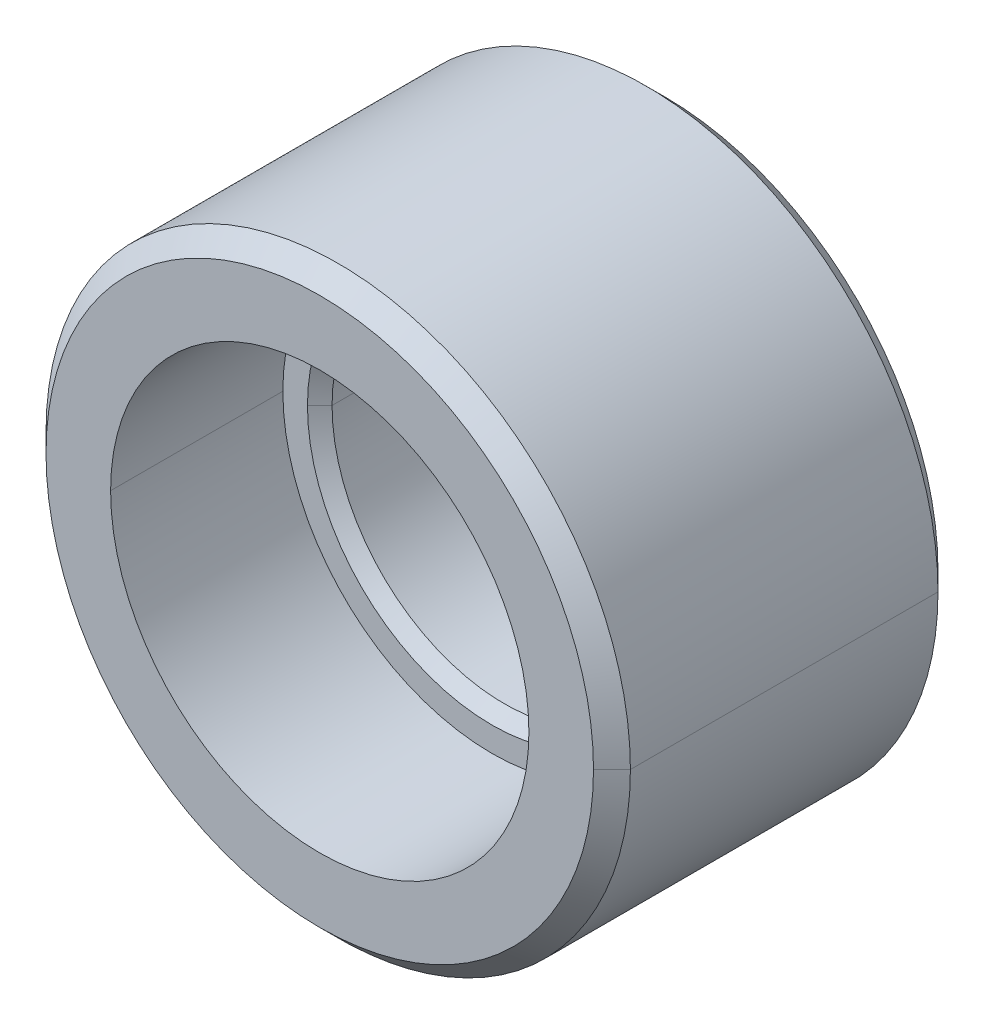
ISO-10303-21;
HEADER;
FILE_DESCRIPTION(('STEP AP214'),'2;1');
FILE_NAME('part.step','',(''),(''),'','','');
FILE_SCHEMA(('AUTOMOTIVE_DESIGN { 1 0 10303 214 1 1 1 1 }'));
ENDSEC;
DATA;
#1=APPLICATION_CONTEXT('core data for automotive mechanical design processes');
#2=APPLICATION_PROTOCOL_DEFINITION('international standard','automotive_design',2000,#1);
#3=PRODUCT_CONTEXT('',#1,'mechanical');
#4=PRODUCT('Part','Part','',(#3));
#5=PRODUCT_RELATED_PRODUCT_CATEGORY('part','',(#4));
#6=PRODUCT_DEFINITION_FORMATION('','',#4);
#7=PRODUCT_DEFINITION_CONTEXT('part definition',#1,'design');
#8=PRODUCT_DEFINITION('design','',#6,#7);
#9=PRODUCT_DEFINITION_SHAPE('','',#8);
#10=(LENGTH_UNIT() NAMED_UNIT(*) SI_UNIT(.MILLI.,.METRE.));
#11=(NAMED_UNIT(*) PLANE_ANGLE_UNIT() SI_UNIT($,.RADIAN.));
#12=(NAMED_UNIT(*) SI_UNIT($,.STERADIAN.) SOLID_ANGLE_UNIT());
#13=UNCERTAINTY_MEASURE_WITH_UNIT(LENGTH_MEASURE(1.E-05),#10,'distance_accuracy_value','');
#14=(GEOMETRIC_REPRESENTATION_CONTEXT(3) GLOBAL_UNCERTAINTY_ASSIGNED_CONTEXT((#13)) GLOBAL_UNIT_ASSIGNED_CONTEXT((#10,
#11,#12)) REPRESENTATION_CONTEXT('',''));
#15=CARTESIAN_POINT('',(0.,0.,0.));
#16=DIRECTION('',(0.,0.,1.));
#17=DIRECTION('',(1.,0.,0.));
#18=AXIS2_PLACEMENT_3D('',#15,#16,#17);
#19=CARTESIAN_POINT('',(0.,0.,1.39999999993279));
#20=DIRECTION('',(0.,0.,1.));
#21=DIRECTION('',(1.,0.,0.));
#22=AXIS2_PLACEMENT_3D('',#19,#20,#21);
#23=CONICAL_SURFACE('',#22,1.49999999990769,0.785398163397448);
#24=DIRECTION('',(-0.707106781186548,0.,0.707106781186548));
#25=VECTOR('',#24,1.);
#26=CARTESIAN_POINT('',(-1.49999999990769,0.,1.39999999993279));
#27=LINE('',#26,#25);
#28=CARTESIAN_POINT('',(-1.4,0.,1.30000000001));
#29=VERTEX_POINT('',#28);
#30=CARTESIAN_POINT('',(-1.49999999996453,0.,1.39999999998963));
#31=VERTEX_POINT('',#30);
#32=EDGE_CURVE('E320',#29,#31,#27,.T.);
#33=ORIENTED_EDGE('',*,*,#32,.F.);
#34=CARTESIAN_POINT('',(0.,0.,1.30000000001));
#35=DIRECTION('',(0.,0.,-1.));
#36=DIRECTION('',(1.,0.,0.));
#37=AXIS2_PLACEMENT_3D('',#34,#35,#36);
#38=CIRCLE('',#37,1.4);
#39=CARTESIAN_POINT('',(1.4,0.,1.30000000001));
#40=VERTEX_POINT('',#39);
#41=EDGE_CURVE('E27',#29,#40,#38,.T.);
#42=ORIENTED_EDGE('',*,*,#41,.T.);
#43=DIRECTION('',(0.707106781186548,0.,0.707106781186548));
#44=VECTOR('',#43,1.);
#45=CARTESIAN_POINT('',(1.49999999990769,0.,1.39999999993279));
#46=LINE('',#45,#44);
#47=CARTESIAN_POINT('',(1.49999999996453,0.,1.39999999998963));
#48=VERTEX_POINT('',#47);
#49=EDGE_CURVE('E249',#40,#48,#46,.T.);
#50=ORIENTED_EDGE('',*,*,#49,.T.);
#51=CARTESIAN_POINT('',(0.,0.,1.39999999998963));
#52=DIRECTION('',(0.,0.,1.));
#53=DIRECTION('',(1.,0.,0.));
#54=AXIS2_PLACEMENT_3D('',#51,#52,#53);
#55=CIRCLE('',#54,1.49999999996453);
#56=EDGE_CURVE('E11',#48,#31,#55,.T.);
#57=ORIENTED_EDGE('',*,*,#56,.T.);
#58=EDGE_LOOP('',(#33,#42,#50,#57));
#59=FACE_BOUND('',#58,.T.);
#60=ADVANCED_FACE('F16',(#59),#23,.F.);
#61=CARTESIAN_POINT('',(0.,0.,1.4));
#62=DIRECTION('',(0.,0.,-1.));
#63=DIRECTION('',(0.,-1.,0.));
#64=AXIS2_PLACEMENT_3D('',#61,#62,#63);
#65=PLANE('',#64);
#66=ORIENTED_EDGE('',*,*,#56,.F.);
#67=CARTESIAN_POINT('',(0.,0.,1.39999999998963));
#68=DIRECTION('',(0.,0.,1.));
#69=DIRECTION('',(1.,0.,0.));
#70=AXIS2_PLACEMENT_3D('',#67,#68,#69);
#71=CIRCLE('',#70,1.49999999996453);
#72=EDGE_CURVE('E257',#31,#48,#71,.T.);
#73=ORIENTED_EDGE('',*,*,#72,.F.);
#74=EDGE_LOOP('',(#66,#73));
#75=FACE_BOUND('',#74,.T.);
#76=CARTESIAN_POINT('',(0.,0.,1.40000000001));
#77=DIRECTION('',(0.,0.,1.));
#78=DIRECTION('',(-1.,0.,0.));
#79=AXIS2_PLACEMENT_3D('',#76,#77,#78);
#80=CIRCLE('',#79,1.7);
#81=CARTESIAN_POINT('',(-1.7,0.,1.40000000001));
#82=VERTEX_POINT('',#81);
#83=CARTESIAN_POINT('',(1.7,0.,1.40000000001));
#84=VERTEX_POINT('',#83);
#85=EDGE_CURVE('E238',#82,#84,#80,.T.);
#86=ORIENTED_EDGE('',*,*,#85,.T.);
#87=CARTESIAN_POINT('',(0.,0.,1.40000000001));
#88=DIRECTION('',(0.,0.,1.));
#89=DIRECTION('',(-1.,0.,0.));
#90=AXIS2_PLACEMENT_3D('',#87,#88,#89);
#91=CIRCLE('',#90,1.7);
#92=EDGE_CURVE('E284',#84,#82,#91,.T.);
#93=ORIENTED_EDGE('',*,*,#92,.T.);
#94=EDGE_LOOP('',(#86,#93));
#95=FACE_BOUND('',#94,.T.);
#96=ADVANCED_FACE('F624',(#75,#95),#65,.F.);
#97=CARTESIAN_POINT('',(0.,0.,0.));
#98=DIRECTION('',(0.,0.,1.));
#99=DIRECTION('',(1.,0.,0.));
#100=AXIS2_PLACEMENT_3D('',#97,#98,#99);
#101=CYLINDRICAL_SURFACE('',#100,1.4);
#102=DIRECTION('',(0.,0.,1.));
#103=VECTOR('',#102,1.);
#104=CARTESIAN_POINT('',(-1.4,0.,0.));
#105=LINE('',#104,#103);
#106=CARTESIAN_POINT('',(-1.40000013965391,0.,0.149999860411754));
#107=VERTEX_POINT('',#106);
#108=EDGE_CURVE('E163',#107,#29,#105,.T.);
#109=ORIENTED_EDGE('',*,*,#108,.F.);
#110=CARTESIAN_POINT('',(0.,0.,0.149999860411754));
#111=DIRECTION('',(0.,0.,-1.));
#112=DIRECTION('',(0.,1.,0.));
#113=AXIS2_PLACEMENT_3D('',#110,#111,#112);
#114=CIRCLE('',#113,1.40000013965391);
#115=CARTESIAN_POINT('',(1.40000013965391,0.,0.149999860411754));
#116=VERTEX_POINT('',#115);
#117=EDGE_CURVE('E199',#107,#116,#114,.T.);
#118=ORIENTED_EDGE('',*,*,#117,.T.);
#119=DIRECTION('',(0.,0.,1.));
#120=VECTOR('',#119,1.);
#121=CARTESIAN_POINT('',(1.4,0.,0.));
#122=LINE('',#121,#120);
#123=EDGE_CURVE('E189',#116,#40,#122,.T.);
#124=ORIENTED_EDGE('',*,*,#123,.T.);
#125=ORIENTED_EDGE('',*,*,#41,.F.);
#126=EDGE_LOOP('',(#109,#118,#124,#125));
#127=FACE_BOUND('',#126,.T.);
#128=ADVANCED_FACE('F426',(#127),#101,.F.);
#129=CARTESIAN_POINT('',(0.,0.,2.8));
#130=DIRECTION('',(0.,0.,-1.));
#131=DIRECTION('',(-1.,0.,0.));
#132=AXIS2_PLACEMENT_3D('',#129,#130,#131);
#133=CYLINDRICAL_SURFACE('',#132,1.7);
#134=DIRECTION('',(0.,0.,-1.));
#135=VECTOR('',#134,1.);
#136=CARTESIAN_POINT('',(1.7,0.,2.8));
#137=LINE('',#136,#135);
#138=CARTESIAN_POINT('',(1.7,0.,2.80000000001));
#139=VERTEX_POINT('',#138);
#140=EDGE_CURVE('E311',#139,#84,#137,.T.);
#141=ORIENTED_EDGE('',*,*,#140,.F.);
#142=CARTESIAN_POINT('',(0.,0.,2.80000000001));
#143=DIRECTION('',(0.,0.,-1.));
#144=DIRECTION('',(-1.,0.,0.));
#145=AXIS2_PLACEMENT_3D('',#142,#143,#144);
#146=CIRCLE('',#145,1.7);
#147=CARTESIAN_POINT('',(-1.7,0.,2.80000000001));
#148=VERTEX_POINT('',#147);
#149=EDGE_CURVE('E220',#148,#139,#146,.T.);
#150=ORIENTED_EDGE('',*,*,#149,.F.);
#151=DIRECTION('',(0.,0.,-1.));
#152=VECTOR('',#151,1.);
#153=CARTESIAN_POINT('',(-1.7,0.,2.8));
#154=LINE('',#153,#152);
#155=EDGE_CURVE('E233',#148,#82,#154,.T.);
#156=ORIENTED_EDGE('',*,*,#155,.T.);
#157=ORIENTED_EDGE('',*,*,#92,.F.);
#158=EDGE_LOOP('',(#141,#150,#156,#157));
#159=FACE_BOUND('',#158,.T.);
#160=ADVANCED_FACE('F664',(#159),#133,.F.);
#161=CARTESIAN_POINT('',(0.,0.,-1.25680799101246E-07));
#162=DIRECTION('',(0.,0.,-1.));
#163=DIRECTION('',(-1.,0.,0.));
#164=AXIS2_PLACEMENT_3D('',#161,#162,#163);
#165=CONICAL_SURFACE('',#164,1.55000012574647,0.785398163397448);
#166=DIRECTION('',(-0.707106781186548,0.,-0.707106781186548));
#167=VECTOR('',#166,1.);
#168=CARTESIAN_POINT('',(-1.55000012574647,0.,-1.25680799101246E-07));
#169=LINE('',#168,#167);
#170=CARTESIAN_POINT('',(-1.55000012574647,0.,-1.25680798884406E-07));
#171=VERTEX_POINT('',#170);
#172=EDGE_CURVE('E298',#107,#171,#169,.T.);
#173=ORIENTED_EDGE('',*,*,#172,.F.);
#174=CARTESIAN_POINT('',(0.,0.,0.149999860411754));
#175=DIRECTION('',(0.,0.,-1.));
#176=DIRECTION('',(0.,1.,0.));
#177=AXIS2_PLACEMENT_3D('',#174,#175,#176);
#178=CIRCLE('',#177,1.40000013965391);
#179=CARTESIAN_POINT('',(-0.500000024847387,-1.30766965576061,0.149999946865687));
#180=VERTEX_POINT('',#179);
#181=EDGE_CURVE('E237',#180,#107,#178,.T.);
#182=ORIENTED_EDGE('',*,*,#181,.F.);
#183=CARTESIAN_POINT('',(-0.5,-1.46714014157094,-6.28403994422031E-08));
#184=CARTESIAN_POINT('',(-0.500000004047261,-1.41414035700841,0.0501664628611142));
#185=CARTESIAN_POINT('',(-0.5,-1.36100083822635,0.100186046830908));
#186=CARTESIAN_POINT('',(-0.500000024847387,-1.30766965576061,0.149999946865687));
#187=(BOUNDED_CURVE() B_SPLINE_CURVE(3,(#183,#184,#185,#186),.UNSPECIFIED.,.F.,
.F.) B_SPLINE_CURVE_WITH_KNOTS((4,4),(0.,0.000218931070984249),
.UNSPECIFIED.) CURVE() GEOMETRIC_REPRESENTATION_ITEM() RATIONAL_B_SPLINE_CURVE((1.,1.,1.,1.)) REPRESENTATION_ITEM(''));
#188=CARTESIAN_POINT('',(-0.5,-1.46714014157094,-6.28403994422031E-08));
#189=VERTEX_POINT('',#188);
#190=EDGE_CURVE('E243',#189,#180,#187,.T.);
#191=ORIENTED_EDGE('',*,*,#190,.F.);
#192=CARTESIAN_POINT('',(0.,0.,-1.25680798884406E-07));
#193=DIRECTION('',(0.,0.,-1.));
#194=DIRECTION('',(-1.,0.,0.));
#195=AXIS2_PLACEMENT_3D('',#192,#193,#194);
#196=CIRCLE('',#195,1.55000012574647);
#197=EDGE_CURVE('E42',#189,#171,#196,.T.);
#198=ORIENTED_EDGE('',*,*,#197,.T.);
#199=EDGE_LOOP('',(#173,#182,#191,#198));
#200=FACE_BOUND('',#199,.T.);
#201=ADVANCED_FACE('F425',(#200),#165,.F.);
#202=CARTESIAN_POINT('',(0.,0.,2.8));
#203=DIRECTION('',(0.,0.,1.));
#204=DIRECTION('',(1.,0.,0.));
#205=AXIS2_PLACEMENT_3D('',#202,#203,#204);
#206=PLANE('',#205);
#207=ORIENTED_EDGE('',*,*,#149,.T.);
#208=CARTESIAN_POINT('',(0.,0.,2.80000000001));
#209=DIRECTION('',(0.,0.,-1.));
#210=DIRECTION('',(-1.,0.,0.));
#211=AXIS2_PLACEMENT_3D('',#208,#209,#210);
#212=CIRCLE('',#211,1.7);
#213=EDGE_CURVE('E307',#139,#148,#212,.T.);
#214=ORIENTED_EDGE('',*,*,#213,.T.);
#215=EDGE_LOOP('',(#207,#214));
#216=FACE_BOUND('',#215,.T.);
#217=CARTESIAN_POINT('',(0.,0.,2.8000000000361));
#218=DIRECTION('',(0.,0.,-1.));
#219=DIRECTION('',(-1.,0.,0.));
#220=AXIS2_PLACEMENT_3D('',#217,#218,#219);
#221=CIRCLE('',#220,2.22500000000991);
#222=CARTESIAN_POINT('',(-2.22500000000991,0.,2.8000000000361));
#223=VERTEX_POINT('',#222);
#224=CARTESIAN_POINT('',(2.22500000000991,0.,2.8000000000361));
#225=VERTEX_POINT('',#224);
#226=EDGE_CURVE('E281',#223,#225,#221,.T.);
#227=ORIENTED_EDGE('',*,*,#226,.F.);
#228=CARTESIAN_POINT('',(0.,0.,2.8000000000361));
#229=DIRECTION('',(0.,0.,-1.));
#230=DIRECTION('',(-1.,0.,0.));
#231=AXIS2_PLACEMENT_3D('',#228,#229,#230);
#232=CIRCLE('',#231,2.22500000000991);
#233=EDGE_CURVE('E229',#225,#223,#232,.T.);
#234=ORIENTED_EDGE('',*,*,#233,.F.);
#235=EDGE_LOOP('',(#227,#234));
#236=FACE_BOUND('',#235,.T.);
#237=ADVANCED_FACE('F608',(#216,#236),#206,.T.);
#238=CARTESIAN_POINT('',(0.,0.,0.));
#239=DIRECTION('',(0.,0.,1.));
#240=DIRECTION('',(1.,0.,0.));
#241=AXIS2_PLACEMENT_3D('',#238,#239,#240);
#242=PLANE('',#241);
#243=DIRECTION('',(0.,1.,0.));
#244=VECTOR('',#243,1.);
#245=CARTESIAN_POINT('',(-0.5,0.,0.));
#246=LINE('',#245,#244);
#247=CARTESIAN_POINT('',(-0.5,-2.16809247958756,0.));
#248=VERTEX_POINT('',#247);
#249=EDGE_CURVE('E268',#248,#189,#246,.T.);
#250=ORIENTED_EDGE('',*,*,#249,.F.);
#251=CARTESIAN_POINT('',(0.,0.,0.));
#252=DIRECTION('',(0.,0.,1.));
#253=DIRECTION('',(1.,0.,0.));
#254=AXIS2_PLACEMENT_3D('',#251,#252,#253);
#255=CIRCLE('',#254,2.22500000000991);
#256=CARTESIAN_POINT('',(-2.22500000000991,0.,0.));
#257=VERTEX_POINT('',#256);
#258=EDGE_CURVE('E239',#257,#248,#255,.T.);
#259=ORIENTED_EDGE('',*,*,#258,.F.);
#260=CARTESIAN_POINT('',(0.,0.,0.));
#261=DIRECTION('',(0.,0.,1.));
#262=DIRECTION('',(1.,0.,0.));
#263=AXIS2_PLACEMENT_3D('',#260,#261,#262);
#264=CIRCLE('',#263,2.22500000000991);
#265=CARTESIAN_POINT('',(2.22500000000991,0.,0.));
#266=VERTEX_POINT('',#265);
#267=EDGE_CURVE('E296',#266,#257,#264,.T.);
#268=ORIENTED_EDGE('',*,*,#267,.F.);
#269=CARTESIAN_POINT('',(0.,0.,0.));
#270=DIRECTION('',(0.,0.,1.));
#271=DIRECTION('',(1.,0.,0.));
#272=AXIS2_PLACEMENT_3D('',#269,#270,#271);
#273=CIRCLE('',#272,2.22500000000991);
#274=CARTESIAN_POINT('',(0.5,-2.16809247958756,0.));
#275=VERTEX_POINT('',#274);
#276=EDGE_CURVE('E262',#275,#266,#273,.T.);
#277=ORIENTED_EDGE('',*,*,#276,.F.);
#278=DIRECTION('',(0.,1.,0.));
#279=VECTOR('',#278,1.);
#280=CARTESIAN_POINT('',(0.5,0.,0.));
#281=LINE('',#280,#279);
#282=CARTESIAN_POINT('',(0.5,-1.46714021525387,-1.32584384469498E-07));
#283=VERTEX_POINT('',#282);
#284=EDGE_CURVE('E242',#275,#283,#281,.T.);
#285=ORIENTED_EDGE('',*,*,#284,.T.);
#286=CARTESIAN_POINT('',(0.,0.,-1.25680798884406E-07));
#287=DIRECTION('',(0.,0.,-1.));
#288=DIRECTION('',(-1.,0.,0.));
#289=AXIS2_PLACEMENT_3D('',#286,#287,#288);
#290=CIRCLE('',#289,1.55000012574647);
#291=CARTESIAN_POINT('',(1.55000012574647,0.,-1.25680798884406E-07));
#292=VERTEX_POINT('',#291);
#293=EDGE_CURVE('E197',#292,#283,#290,.T.);
#294=ORIENTED_EDGE('',*,*,#293,.F.);
#295=CARTESIAN_POINT('',(0.,0.,-1.25680798884406E-07));
#296=DIRECTION('',(0.,0.,-1.));
#297=DIRECTION('',(-1.,0.,0.));
#298=AXIS2_PLACEMENT_3D('',#295,#296,#297);
#299=CIRCLE('',#298,1.55000012574647);
#300=EDGE_CURVE('E305',#171,#292,#299,.T.);
#301=ORIENTED_EDGE('',*,*,#300,.F.);
#302=ORIENTED_EDGE('',*,*,#197,.F.);
#303=EDGE_LOOP('',(#250,#259,#268,#277,#285,#294,#301,#302));
#304=FACE_BOUND('',#303,.T.);
#305=ADVANCED_FACE('F330',(#304),#242,.F.);
#306=CARTESIAN_POINT('',(0.,0.,2.65000000013061));
#307=DIRECTION('',(0.,0.,-1.));
#308=DIRECTION('',(-1.,0.,0.));
#309=AXIS2_PLACEMENT_3D('',#306,#307,#308);
#310=CONICAL_SURFACE('',#309,2.37499999991541,0.785398163397448);
#311=DIRECTION('',(0.707106781186548,0.,-0.707106781186548));
#312=VECTOR('',#311,1.);
#313=CARTESIAN_POINT('',(2.37499999991541,0.,2.65000000013061));
#314=LINE('',#313,#312);
#315=CARTESIAN_POINT('',(2.37500000003602,0.,2.65000000001));
#316=VERTEX_POINT('',#315);
#317=EDGE_CURVE('E216',#225,#316,#314,.T.);
#318=ORIENTED_EDGE('',*,*,#317,.F.);
#319=ORIENTED_EDGE('',*,*,#233,.T.);
#320=DIRECTION('',(-0.707106781186548,0.,-0.707106781186548));
#321=VECTOR('',#320,1.);
#322=CARTESIAN_POINT('',(-2.37499999991541,0.,2.65000000013061));
#323=LINE('',#322,#321);
#324=CARTESIAN_POINT('',(-2.37500000003602,0.,2.65000000001));
#325=VERTEX_POINT('',#324);
#326=EDGE_CURVE('E206',#223,#325,#323,.T.);
#327=ORIENTED_EDGE('',*,*,#326,.T.);
#328=CARTESIAN_POINT('',(0.,0.,2.65000000001));
#329=DIRECTION('',(0.,0.,-1.));
#330=DIRECTION('',(1.,0.,0.));
#331=AXIS2_PLACEMENT_3D('',#328,#329,#330);
#332=CIRCLE('',#331,2.375);
#333=EDGE_CURVE('E300',#316,#325,#332,.T.);
#334=ORIENTED_EDGE('',*,*,#333,.F.);
#335=EDGE_LOOP('',(#318,#319,#327,#334));
#336=FACE_BOUND('',#335,.T.);
#337=ADVANCED_FACE('F592',(#336),#310,.T.);
#338=CARTESIAN_POINT('',(0.5,0.,0.));
#339=DIRECTION('',(1.,0.,0.));
#340=DIRECTION('',(0.,1.,0.));
#341=AXIS2_PLACEMENT_3D('',#338,#339,#340);
#342=PLANE('',#341);
#343=DIRECTION('',(0.,0.,-1.));
#344=VECTOR('',#343,1.);
#345=CARTESIAN_POINT('',(0.499999999999966,-2.32177195262584,0.));
#346=LINE('',#345,#344);
#347=CARTESIAN_POINT('',(0.499999999999983,-2.32177195262584,0.5));
#348=VERTEX_POINT('',#347);
#349=CARTESIAN_POINT('',(0.499999999999983,-2.32177195262015,0.149999999989478));
#350=VERTEX_POINT('',#349);
#351=EDGE_CURVE('E277',#348,#350,#346,.T.);
#352=ORIENTED_EDGE('',*,*,#351,.F.);
#353=DIRECTION('',(0.,-1.,0.));
#354=VECTOR('',#353,1.);
#355=CARTESIAN_POINT('',(0.5,0.,0.5));
#356=LINE('',#355,#354);
#357=CARTESIAN_POINT('',(0.500000000000034,-1.30766968306219,0.5));
#358=VERTEX_POINT('',#357);
#359=EDGE_CURVE('E182',#358,#348,#356,.T.);
#360=ORIENTED_EDGE('',*,*,#359,.F.);
#361=DIRECTION('',(0.,0.,-1.));
#362=VECTOR('',#361,1.);
#363=CARTESIAN_POINT('',(0.500000000000068,-1.30766968306218,0.));
#364=LINE('',#363,#362);
#365=CARTESIAN_POINT('',(0.500000000000034,-1.3076697578194,0.14999993023871));
#366=VERTEX_POINT('',#365);
#367=EDGE_CURVE('E176',#358,#366,#364,.T.);
#368=ORIENTED_EDGE('',*,*,#367,.T.);
#369=CARTESIAN_POINT('',(0.500000000000034,-1.3076697578194,0.14999993023871));
#370=CARTESIAN_POINT('',(0.50000004078633,-1.36100070535829,0.100186215895298));
#371=CARTESIAN_POINT('',(0.5,-1.41414033902506,0.0501664759348211));
#372=CARTESIAN_POINT('',(0.5,-1.46714021525387,-1.32584384469498E-07));
#373=(BOUNDED_CURVE() B_SPLINE_CURVE(3,(#369,#370,#371,#372),.UNSPECIFIED.,.F.,
.F.) B_SPLINE_CURVE_WITH_KNOTS((4,4),(5.54172776968878E-10,0.000218931697780279),
.UNSPECIFIED.) CURVE() GEOMETRIC_REPRESENTATION_ITEM() RATIONAL_B_SPLINE_CURVE((1.,1.,1.,1.)) REPRESENTATION_ITEM(''));
#374=EDGE_CURVE('E180',#366,#283,#373,.T.);
#375=ORIENTED_EDGE('',*,*,#374,.T.);
#376=ORIENTED_EDGE('',*,*,#284,.F.);
#377=CARTESIAN_POINT('',(0.499999999999983,-2.32177195262015,0.149999999989478));
#378=CARTESIAN_POINT('',(0.5,-2.27058464216311,0.0999598897742137));
#379=CARTESIAN_POINT('',(0.5,-2.21936082398381,0.0499570840116492));
#380=CARTESIAN_POINT('',(0.5,-2.16809247958756,0.));
#381=(BOUNDED_CURVE() B_SPLINE_CURVE(3,(#377,#378,#379,#380),.UNSPECIFIED.,.F.,
.F.) B_SPLINE_CURVE_WITH_KNOTS((4,4),(0.,0.000214749576072951),
.UNSPECIFIED.) CURVE() GEOMETRIC_REPRESENTATION_ITEM() RATIONAL_B_SPLINE_CURVE((1.,1.,1.,1.)) REPRESENTATION_ITEM(''));
#382=EDGE_CURVE('E261',#350,#275,#381,.T.);
#383=ORIENTED_EDGE('',*,*,#382,.F.);
#384=EDGE_LOOP('',(#352,#360,#368,#375,#376,#383));
#385=FACE_BOUND('',#384,.T.);
#386=ADVANCED_FACE('F179',(#385),#342,.F.);
#387=CARTESIAN_POINT('',(0.,0.,0.149999999962347));
#388=DIRECTION('',(0.,0.,1.));
#389=DIRECTION('',(1.,0.,0.));
#390=AXIS2_PLACEMENT_3D('',#387,#388,#389);
#391=CONICAL_SURFACE('',#390,2.37499999997226,0.785398163397448);
#392=DIRECTION('',(-0.707106781186548,0.,0.707106781186548));
#393=VECTOR('',#392,1.);
#394=CARTESIAN_POINT('',(-2.37499999997226,0.,0.149999999962347));
#395=LINE('',#394,#393);
#396=CARTESIAN_POINT('',(-2.37500000000991,0.,0.15));
#397=VERTEX_POINT('',#396);
#398=EDGE_CURVE('E20',#257,#397,#395,.T.);
#399=ORIENTED_EDGE('',*,*,#398,.F.);
#400=ORIENTED_EDGE('',*,*,#258,.T.);
#401=CARTESIAN_POINT('',(-0.5,-2.16809247958756,0.));
#402=CARTESIAN_POINT('',(-0.5,-2.21936082398793,0.0499570840156576));
#403=CARTESIAN_POINT('',(-0.5,-2.27058464217334,0.0999598897842029));
#404=CARTESIAN_POINT('',(-0.499999999999983,-2.32177195262832,0.149999999997467));
#405=(BOUNDED_CURVE() B_SPLINE_CURVE(3,(#401,#402,#403,#404),.UNSPECIFIED.,.F.,
.F.) B_SPLINE_CURVE_WITH_KNOTS((4,4),(0.,0.000214749576101867),
.UNSPECIFIED.) CURVE() GEOMETRIC_REPRESENTATION_ITEM() RATIONAL_B_SPLINE_CURVE((1.,1.,1.,1.)) REPRESENTATION_ITEM(''));
#406=CARTESIAN_POINT('',(-0.499999999999983,-2.32177195262832,0.149999999997467));
#407=VERTEX_POINT('',#406);
#408=EDGE_CURVE('E263',#248,#407,#405,.T.);
#409=ORIENTED_EDGE('',*,*,#408,.T.);
#410=CARTESIAN_POINT('',(0.,0.,0.15));
#411=DIRECTION('',(0.,0.,1.));
#412=DIRECTION('',(1.,0.,0.));
#413=AXIS2_PLACEMENT_3D('',#410,#411,#412);
#414=CIRCLE('',#413,2.375);
#415=EDGE_CURVE('E244',#397,#407,#414,.T.);
#416=ORIENTED_EDGE('',*,*,#415,.F.);
#417=EDGE_LOOP('',(#399,#400,#409,#416));
#418=FACE_BOUND('',#417,.T.);
#419=ADVANCED_FACE('F404',(#418),#391,.T.);
#420=CARTESIAN_POINT('',(-0.5,-3.,0.));
#421=DIRECTION('',(-1.,0.,0.));
#422=DIRECTION('',(0.,0.,1.));
#423=AXIS2_PLACEMENT_3D('',#420,#421,#422);
#424=PLANE('',#423);
#425=DIRECTION('',(0.,0.,1.));
#426=VECTOR('',#425,1.);
#427=CARTESIAN_POINT('',(-0.500000049694773,-1.30766966406093,0.));
#428=LINE('',#427,#426);
#429=CARTESIAN_POINT('',(-0.500000024847387,-1.30766967356157,0.5));
#430=VERTEX_POINT('',#429);
#431=EDGE_CURVE('E232',#180,#430,#428,.T.);
#432=ORIENTED_EDGE('',*,*,#431,.T.);
#433=DIRECTION('',(0.,1.,0.));
#434=VECTOR('',#433,1.);
#435=CARTESIAN_POINT('',(-0.5,0.,0.5));
#436=LINE('',#435,#434);
#437=CARTESIAN_POINT('',(-0.499999999999983,-2.32177195262584,0.5));
#438=VERTEX_POINT('',#437);
#439=EDGE_CURVE('E269',#438,#430,#436,.T.);
#440=ORIENTED_EDGE('',*,*,#439,.F.);
#441=DIRECTION('',(0.,0.,1.));
#442=VECTOR('',#441,1.);
#443=CARTESIAN_POINT('',(-0.499999999999967,-2.32177195262584,0.));
#444=LINE('',#443,#442);
#445=EDGE_CURVE('E248',#407,#438,#444,.T.);
#446=ORIENTED_EDGE('',*,*,#445,.F.);
#447=ORIENTED_EDGE('',*,*,#408,.F.);
#448=ORIENTED_EDGE('',*,*,#249,.T.);
#449=ORIENTED_EDGE('',*,*,#190,.T.);
#450=EDGE_LOOP('',(#432,#440,#446,#447,#448,#449));
#451=FACE_BOUND('',#450,.T.);
#452=ADVANCED_FACE('F422',(#451),#424,.F.);
#453=CARTESIAN_POINT('',(0.,0.,0.5));
#454=DIRECTION('',(0.,0.,-1.));
#455=DIRECTION('',(0.,-1.,0.));
#456=AXIS2_PLACEMENT_3D('',#453,#454,#455);
#457=PLANE('',#456);
#458=ORIENTED_EDGE('',*,*,#359,.T.);
#459=CARTESIAN_POINT('',(0.,0.,0.5));
#460=DIRECTION('',(0.,0.,1.));
#461=DIRECTION('',(1.,0.,0.));
#462=AXIS2_PLACEMENT_3D('',#459,#460,#461);
#463=CIRCLE('',#462,2.375);
#464=EDGE_CURVE('E270',#438,#348,#463,.T.);
#465=ORIENTED_EDGE('',*,*,#464,.F.);
#466=ORIENTED_EDGE('',*,*,#439,.T.);
#467=CARTESIAN_POINT('',(0.,0.,0.5));
#468=DIRECTION('',(0.,0.,1.));
#469=DIRECTION('',(1.,0.,0.));
#470=AXIS2_PLACEMENT_3D('',#467,#468,#469);
#471=CIRCLE('',#470,1.4);
#472=EDGE_CURVE('E188',#430,#358,#471,.T.);
#473=ORIENTED_EDGE('',*,*,#472,.T.);
#474=EDGE_LOOP('',(#458,#465,#466,#473));
#475=FACE_BOUND('',#474,.T.);
#476=ADVANCED_FACE('F416',(#475),#457,.T.);
#477=CARTESIAN_POINT('',(0.,0.,0.));
#478=DIRECTION('',(0.,0.,1.));
#479=DIRECTION('',(1.,0.,0.));
#480=AXIS2_PLACEMENT_3D('',#477,#478,#479);
#481=CYLINDRICAL_SURFACE('',#480,2.375);
#482=DIRECTION('',(0.,0.,1.));
#483=VECTOR('',#482,1.);
#484=CARTESIAN_POINT('',(-2.375,0.,0.));
#485=LINE('',#484,#483);
#486=EDGE_CURVE('E226',#397,#325,#485,.T.);
#487=ORIENTED_EDGE('',*,*,#486,.F.);
#488=ORIENTED_EDGE('',*,*,#415,.T.);
#489=ORIENTED_EDGE('',*,*,#445,.T.);
#490=ORIENTED_EDGE('',*,*,#464,.T.);
#491=ORIENTED_EDGE('',*,*,#351,.T.);
#492=CARTESIAN_POINT('',(0.,0.,0.15));
#493=DIRECTION('',(0.,0.,1.));
#494=DIRECTION('',(1.,0.,0.));
#495=AXIS2_PLACEMENT_3D('',#492,#493,#494);
#496=CIRCLE('',#495,2.375);
#497=CARTESIAN_POINT('',(2.37500000000991,0.,0.15));
#498=VERTEX_POINT('',#497);
#499=EDGE_CURVE('E258',#350,#498,#496,.T.);
#500=ORIENTED_EDGE('',*,*,#499,.T.);
#501=DIRECTION('',(0.,0.,1.));
#502=VECTOR('',#501,1.);
#503=CARTESIAN_POINT('',(2.375,0.,0.));
#504=LINE('',#503,#502);
#505=EDGE_CURVE('E225',#498,#316,#504,.T.);
#506=ORIENTED_EDGE('',*,*,#505,.T.);
#507=ORIENTED_EDGE('',*,*,#333,.T.);
#508=EDGE_LOOP('',(#487,#488,#489,#490,#491,#500,#506,#507));
#509=FACE_BOUND('',#508,.T.);
#510=ADVANCED_FACE('F408',(#509),#481,.T.);
#511=CARTESIAN_POINT('',(0.,0.,1.39999999993279));
#512=DIRECTION('',(0.,0.,1.));
#513=DIRECTION('',(1.,0.,0.));
#514=AXIS2_PLACEMENT_3D('',#511,#512,#513);
#515=CONICAL_SURFACE('',#514,1.49999999990769,0.785398163397448);
#516=CARTESIAN_POINT('',(0.,0.,1.30000000001));
#517=DIRECTION('',(0.,0.,-1.));
#518=DIRECTION('',(1.,0.,0.));
#519=AXIS2_PLACEMENT_3D('',#516,#517,#518);
#520=CIRCLE('',#519,1.4);
#521=EDGE_CURVE('E250',#40,#29,#520,.T.);
#522=ORIENTED_EDGE('',*,*,#521,.T.);
#523=ORIENTED_EDGE('',*,*,#32,.T.);
#524=ORIENTED_EDGE('',*,*,#72,.T.);
#525=ORIENTED_EDGE('',*,*,#49,.F.);
#526=EDGE_LOOP('',(#522,#523,#524,#525));
#527=FACE_BOUND('',#526,.T.);
#528=ADVANCED_FACE('F431',(#527),#515,.F.);
#529=CARTESIAN_POINT('',(0.,0.,0.));
#530=DIRECTION('',(0.,0.,1.));
#531=DIRECTION('',(1.,0.,0.));
#532=AXIS2_PLACEMENT_3D('',#529,#530,#531);
#533=CYLINDRICAL_SURFACE('',#532,1.4);
#534=ORIENTED_EDGE('',*,*,#181,.T.);
#535=ORIENTED_EDGE('',*,*,#108,.T.);
#536=ORIENTED_EDGE('',*,*,#521,.F.);
#537=ORIENTED_EDGE('',*,*,#123,.F.);
#538=CARTESIAN_POINT('',(0.,0.,0.149999860411754));
#539=DIRECTION('',(0.,0.,-1.));
#540=DIRECTION('',(0.,1.,0.));
#541=AXIS2_PLACEMENT_3D('',#538,#539,#540);
#542=CIRCLE('',#541,1.40000013965391);
#543=EDGE_CURVE('E195',#116,#366,#542,.T.);
#544=ORIENTED_EDGE('',*,*,#543,.T.);
#545=ORIENTED_EDGE('',*,*,#367,.F.);
#546=ORIENTED_EDGE('',*,*,#472,.F.);
#547=ORIENTED_EDGE('',*,*,#431,.F.);
#548=EDGE_LOOP('',(#534,#535,#536,#537,#544,#545,#546,#547));
#549=FACE_BOUND('',#548,.T.);
#550=ADVANCED_FACE('F201',(#549),#533,.F.);
#551=CARTESIAN_POINT('',(0.,0.,2.8));
#552=DIRECTION('',(0.,0.,-1.));
#553=DIRECTION('',(-1.,0.,0.));
#554=AXIS2_PLACEMENT_3D('',#551,#552,#553);
#555=CYLINDRICAL_SURFACE('',#554,1.7);
#556=ORIENTED_EDGE('',*,*,#213,.F.);
#557=ORIENTED_EDGE('',*,*,#140,.T.);
#558=ORIENTED_EDGE('',*,*,#85,.F.);
#559=ORIENTED_EDGE('',*,*,#155,.F.);
#560=EDGE_LOOP('',(#556,#557,#558,#559));
#561=FACE_BOUND('',#560,.T.);
#562=ADVANCED_FACE('F651',(#561),#555,.F.);
#563=CARTESIAN_POINT('',(0.,0.,-1.25680799101246E-07));
#564=DIRECTION('',(0.,0.,-1.));
#565=DIRECTION('',(-1.,0.,0.));
#566=AXIS2_PLACEMENT_3D('',#563,#564,#565);
#567=CONICAL_SURFACE('',#566,1.55000012574647,0.785398163397448);
#568=DIRECTION('',(0.707106781186548,0.,-0.707106781186548));
#569=VECTOR('',#568,1.);
#570=CARTESIAN_POINT('',(1.55000012574647,0.,-1.25680799101246E-07));
#571=LINE('',#570,#569);
#572=EDGE_CURVE('E205',#116,#292,#571,.T.);
#573=ORIENTED_EDGE('',*,*,#572,.F.);
#574=ORIENTED_EDGE('',*,*,#117,.F.);
#575=ORIENTED_EDGE('',*,*,#172,.T.);
#576=ORIENTED_EDGE('',*,*,#300,.T.);
#577=EDGE_LOOP('',(#573,#574,#575,#576));
#578=FACE_BOUND('',#577,.T.);
#579=ADVANCED_FACE('F328',(#578),#567,.F.);
#580=CARTESIAN_POINT('',(0.,0.,-1.25680799101246E-07));
#581=DIRECTION('',(0.,0.,-1.));
#582=DIRECTION('',(-1.,0.,0.));
#583=AXIS2_PLACEMENT_3D('',#580,#581,#582);
#584=CONICAL_SURFACE('',#583,1.55000012574647,0.785398163397448);
#585=ORIENTED_EDGE('',*,*,#543,.F.);
#586=ORIENTED_EDGE('',*,*,#572,.T.);
#587=ORIENTED_EDGE('',*,*,#293,.T.);
#588=ORIENTED_EDGE('',*,*,#374,.F.);
#589=EDGE_LOOP('',(#585,#586,#587,#588));
#590=FACE_BOUND('',#589,.T.);
#591=ADVANCED_FACE('F193',(#590),#584,.F.);
#592=CARTESIAN_POINT('',(0.,0.,2.65000000013061));
#593=DIRECTION('',(0.,0.,-1.));
#594=DIRECTION('',(-1.,0.,0.));
#595=AXIS2_PLACEMENT_3D('',#592,#593,#594);
#596=CONICAL_SURFACE('',#595,2.37499999991541,0.785398163397448);
#597=ORIENTED_EDGE('',*,*,#226,.T.);
#598=ORIENTED_EDGE('',*,*,#317,.T.);
#599=CARTESIAN_POINT('',(0.,0.,2.65000000001));
#600=DIRECTION('',(0.,0.,-1.));
#601=DIRECTION('',(1.,0.,0.));
#602=AXIS2_PLACEMENT_3D('',#599,#600,#601);
#603=CIRCLE('',#602,2.375);
#604=EDGE_CURVE('E222',#325,#316,#603,.T.);
#605=ORIENTED_EDGE('',*,*,#604,.F.);
#606=ORIENTED_EDGE('',*,*,#326,.F.);
#607=EDGE_LOOP('',(#597,#598,#605,#606));
#608=FACE_BOUND('',#607,.T.);
#609=ADVANCED_FACE('F643',(#608),#596,.T.);
#610=CARTESIAN_POINT('',(0.,0.,0.149999999962347));
#611=DIRECTION('',(0.,0.,1.));
#612=DIRECTION('',(1.,0.,0.));
#613=AXIS2_PLACEMENT_3D('',#610,#611,#612);
#614=CONICAL_SURFACE('',#613,2.37499999997226,0.785398163397448);
#615=ORIENTED_EDGE('',*,*,#276,.T.);
#616=DIRECTION('',(0.707106781186548,0.,0.707106781186548));
#617=VECTOR('',#616,1.);
#618=CARTESIAN_POINT('',(2.37499999997226,0.,0.149999999962347));
#619=LINE('',#618,#617);
#620=EDGE_CURVE('E363',#266,#498,#619,.T.);
#621=ORIENTED_EDGE('',*,*,#620,.T.);
#622=ORIENTED_EDGE('',*,*,#499,.F.);
#623=ORIENTED_EDGE('',*,*,#382,.T.);
#624=EDGE_LOOP('',(#615,#621,#622,#623));
#625=FACE_BOUND('',#624,.T.);
#626=ADVANCED_FACE('F413',(#625),#614,.T.);
#627=CARTESIAN_POINT('',(0.,0.,0.149999999962347));
#628=DIRECTION('',(0.,0.,1.));
#629=DIRECTION('',(1.,0.,0.));
#630=AXIS2_PLACEMENT_3D('',#627,#628,#629);
#631=CONICAL_SURFACE('',#630,2.37499999997226,0.785398163397448);
#632=ORIENTED_EDGE('',*,*,#267,.T.);
#633=ORIENTED_EDGE('',*,*,#398,.T.);
#634=CARTESIAN_POINT('',(0.,0.,0.15));
#635=DIRECTION('',(0.,0.,1.));
#636=DIRECTION('',(1.,0.,0.));
#637=AXIS2_PLACEMENT_3D('',#634,#635,#636);
#638=CIRCLE('',#637,2.375);
#639=EDGE_CURVE('E285',#498,#397,#638,.T.);
#640=ORIENTED_EDGE('',*,*,#639,.F.);
#641=ORIENTED_EDGE('',*,*,#620,.F.);
#642=EDGE_LOOP('',(#632,#633,#640,#641));
#643=FACE_BOUND('',#642,.T.);
#644=ADVANCED_FACE('F18',(#643),#631,.T.);
#645=CARTESIAN_POINT('',(0.,0.,0.));
#646=DIRECTION('',(0.,0.,1.));
#647=DIRECTION('',(1.,0.,0.));
#648=AXIS2_PLACEMENT_3D('',#645,#646,#647);
#649=CYLINDRICAL_SURFACE('',#648,2.375);
#650=ORIENTED_EDGE('',*,*,#639,.T.);
#651=ORIENTED_EDGE('',*,*,#486,.T.);
#652=ORIENTED_EDGE('',*,*,#604,.T.);
#653=ORIENTED_EDGE('',*,*,#505,.F.);
#654=EDGE_LOOP('',(#650,#651,#652,#653));
#655=FACE_BOUND('',#654,.T.);
#656=ADVANCED_FACE('F410',(#655),#649,.T.);
#657=CLOSED_SHELL('',(#60,#96,#128,#160,#201,#237,#305,#337,#386,#419,#452,#476,#510,#528,#550,
#562,#579,#591,#609,#626,#644,#656));
#658=MANIFOLD_SOLID_BREP('B1',#657);
#659=ADVANCED_BREP_SHAPE_REPRESENTATION('',(#18,#658),#14);
#660=SHAPE_DEFINITION_REPRESENTATION(#9,#659);
ENDSEC;
END-ISO-10303-21;
